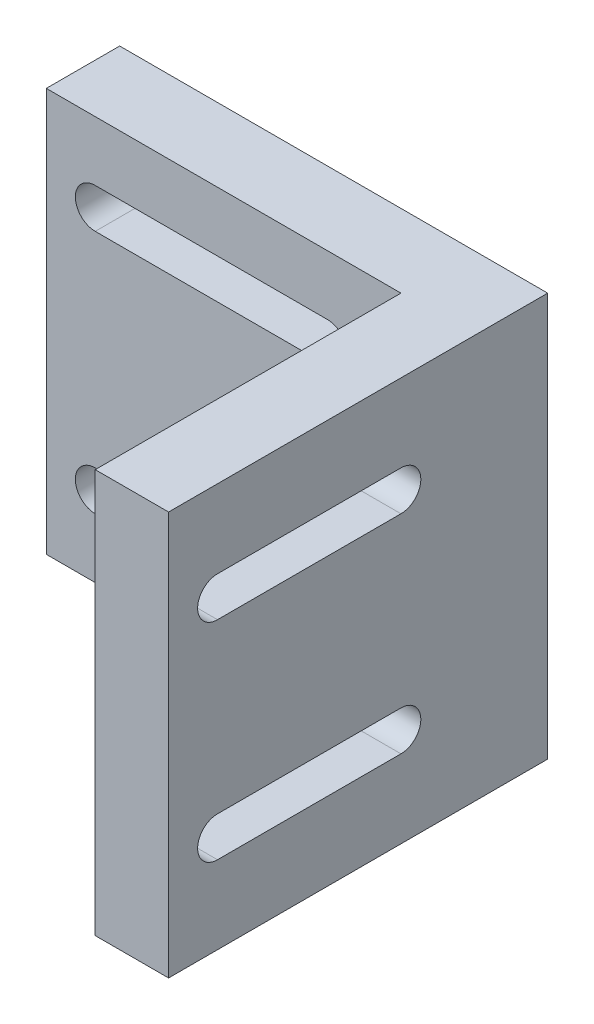
ISO-10303-21;
HEADER;
FILE_DESCRIPTION(('STEP AP214'),'2;1');
FILE_NAME('part.step','',(''),(''),'','','');
FILE_SCHEMA(('AUTOMOTIVE_DESIGN { 1 0 10303 214 1 1 1 1 }'));
ENDSEC;
DATA;
#1=APPLICATION_CONTEXT('core data for automotive mechanical design processes');
#2=APPLICATION_PROTOCOL_DEFINITION('international standard','automotive_design',2000,#1);
#3=PRODUCT_CONTEXT('',#1,'mechanical');
#4=PRODUCT('Part','Part','',(#3));
#5=PRODUCT_RELATED_PRODUCT_CATEGORY('part','',(#4));
#6=PRODUCT_DEFINITION_FORMATION('','',#4);
#7=PRODUCT_DEFINITION_CONTEXT('part definition',#1,'design');
#8=PRODUCT_DEFINITION('design','',#6,#7);
#9=PRODUCT_DEFINITION_SHAPE('','',#8);
#10=(LENGTH_UNIT() NAMED_UNIT(*) SI_UNIT(.MILLI.,.METRE.));
#11=(NAMED_UNIT(*) PLANE_ANGLE_UNIT() SI_UNIT($,.RADIAN.));
#12=(NAMED_UNIT(*) SI_UNIT($,.STERADIAN.) SOLID_ANGLE_UNIT());
#13=UNCERTAINTY_MEASURE_WITH_UNIT(LENGTH_MEASURE(1.E-05),#10,'distance_accuracy_value','');
#14=(GEOMETRIC_REPRESENTATION_CONTEXT(3) GLOBAL_UNCERTAINTY_ASSIGNED_CONTEXT((#13)) GLOBAL_UNIT_ASSIGNED_CONTEXT((#10,
#11,#12)) REPRESENTATION_CONTEXT('',''));
#15=CARTESIAN_POINT('',(0.,0.,0.));
#16=DIRECTION('',(0.,0.,1.));
#17=DIRECTION('',(1.,0.,0.));
#18=AXIS2_PLACEMENT_3D('',#15,#16,#17);
#19=CARTESIAN_POINT('',(0.,66.,12.));
#20=DIRECTION('',(0.,0.,-1.));
#21=DIRECTION('',(-1.,0.,0.));
#22=AXIS2_PLACEMENT_3D('',#19,#20,#21);
#23=PLANE('',#22);
#24=DIRECTION('',(1.,0.,0.));
#25=VECTOR('',#24,1.);
#26=CARTESIAN_POINT('',(8.00000000000001,49.75,12.));
#27=LINE('',#26,#25);
#28=CARTESIAN_POINT('',(8.00000000000001,49.75,12.));
#29=VERTEX_POINT('',#28);
#30=CARTESIAN_POINT('',(46.,49.75,12.));
#31=VERTEX_POINT('',#30);
#32=EDGE_CURVE('E193',#29,#31,#27,.T.);
#33=ORIENTED_EDGE('',*,*,#32,.F.);
#34=CARTESIAN_POINT('',(8.00000000000001,53.,12.));
#35=DIRECTION('',(0.,0.,1.));
#36=DIRECTION('',(-1.,0.,0.));
#37=AXIS2_PLACEMENT_3D('',#34,#35,#36);
#38=CIRCLE('',#37,3.25);
#39=CARTESIAN_POINT('',(8.00000000000001,56.25,12.));
#40=VERTEX_POINT('',#39);
#41=EDGE_CURVE('E48',#40,#29,#38,.T.);
#42=ORIENTED_EDGE('',*,*,#41,.F.);
#43=DIRECTION('',(-1.,0.,0.));
#44=VECTOR('',#43,1.);
#45=CARTESIAN_POINT('',(8.00000000000001,56.25,12.));
#46=LINE('',#45,#44);
#47=CARTESIAN_POINT('',(46.,56.25,12.));
#48=VERTEX_POINT('',#47);
#49=EDGE_CURVE('E199',#48,#40,#46,.T.);
#50=ORIENTED_EDGE('',*,*,#49,.F.);
#51=CARTESIAN_POINT('',(46.,53.,12.));
#52=DIRECTION('',(0.,0.,1.));
#53=DIRECTION('',(-1.,0.,0.));
#54=AXIS2_PLACEMENT_3D('',#51,#52,#53);
#55=CIRCLE('',#54,3.25);
#56=EDGE_CURVE('E184',#31,#48,#55,.T.);
#57=ORIENTED_EDGE('',*,*,#56,.F.);
#58=EDGE_LOOP('',(#33,#42,#50,#57));
#59=FACE_BOUND('',#58,.T.);
#60=DIRECTION('',(1.,0.,0.));
#61=VECTOR('',#60,1.);
#62=CARTESIAN_POINT('',(8.00000000000001,9.75,12.));
#63=LINE('',#62,#61);
#64=CARTESIAN_POINT('',(8.00000000000001,9.75,12.));
#65=VERTEX_POINT('',#64);
#66=CARTESIAN_POINT('',(46.,9.75000000000001,12.));
#67=VERTEX_POINT('',#66);
#68=EDGE_CURVE('E210',#65,#67,#63,.T.);
#69=ORIENTED_EDGE('',*,*,#68,.F.);
#70=CARTESIAN_POINT('',(8.00000000000001,13.,12.));
#71=DIRECTION('',(0.,0.,1.));
#72=DIRECTION('',(1.,0.,0.));
#73=AXIS2_PLACEMENT_3D('',#70,#71,#72);
#74=CIRCLE('',#73,3.25);
#75=CARTESIAN_POINT('',(8.00000000000001,16.25,12.));
#76=VERTEX_POINT('',#75);
#77=EDGE_CURVE('E206',#76,#65,#74,.T.);
#78=ORIENTED_EDGE('',*,*,#77,.F.);
#79=DIRECTION('',(-1.,0.,0.));
#80=VECTOR('',#79,1.);
#81=CARTESIAN_POINT('',(8.00000000000001,16.25,12.));
#82=LINE('',#81,#80);
#83=CARTESIAN_POINT('',(46.,16.25,12.));
#84=VERTEX_POINT('',#83);
#85=EDGE_CURVE('E216',#84,#76,#82,.T.);
#86=ORIENTED_EDGE('',*,*,#85,.F.);
#87=CARTESIAN_POINT('',(46.,13.,12.));
#88=DIRECTION('',(0.,0.,1.));
#89=DIRECTION('',(1.,0.,0.));
#90=AXIS2_PLACEMENT_3D('',#87,#88,#89);
#91=CIRCLE('',#90,3.25);
#92=EDGE_CURVE('E213',#67,#84,#91,.T.);
#93=ORIENTED_EDGE('',*,*,#92,.F.);
#94=EDGE_LOOP('',(#69,#78,#86,#93));
#95=FACE_BOUND('',#94,.T.);
#96=DIRECTION('',(0.,-1.,0.));
#97=VECTOR('',#96,1.);
#98=CARTESIAN_POINT('',(58.,0.,12.));
#99=LINE('',#98,#97);
#100=CARTESIAN_POINT('',(58.,66.,12.));
#101=VERTEX_POINT('',#100);
#102=CARTESIAN_POINT('',(58.,0.,12.));
#103=VERTEX_POINT('',#102);
#104=EDGE_CURVE('E292',#101,#103,#99,.T.);
#105=ORIENTED_EDGE('',*,*,#104,.F.);
#106=DIRECTION('',(-1.,0.,0.));
#107=VECTOR('',#106,1.);
#108=CARTESIAN_POINT('',(0.,66.,12.));
#109=LINE('',#108,#107);
#110=CARTESIAN_POINT('',(0.,66.,12.));
#111=VERTEX_POINT('',#110);
#112=EDGE_CURVE('E312',#101,#111,#109,.T.);
#113=ORIENTED_EDGE('',*,*,#112,.T.);
#114=DIRECTION('',(0.,-1.,0.));
#115=VECTOR('',#114,1.);
#116=CARTESIAN_POINT('',(0.,0.,12.));
#117=LINE('',#116,#115);
#118=CARTESIAN_POINT('',(0.,0.,12.));
#119=VERTEX_POINT('',#118);
#120=EDGE_CURVE('E306',#111,#119,#117,.T.);
#121=ORIENTED_EDGE('',*,*,#120,.T.);
#122=DIRECTION('',(1.,0.,0.));
#123=VECTOR('',#122,1.);
#124=CARTESIAN_POINT('',(0.,0.,12.));
#125=LINE('',#124,#123);
#126=EDGE_CURVE('E410',#119,#103,#125,.T.);
#127=ORIENTED_EDGE('',*,*,#126,.T.);
#128=EDGE_LOOP('',(#105,#113,#121,#127));
#129=FACE_BOUND('',#128,.T.);
#130=ADVANCED_FACE('F33',(#59,#95,#129),#23,.F.);
#131=CARTESIAN_POINT('',(0.,0.,12.));
#132=DIRECTION('',(1.,0.,0.));
#133=DIRECTION('',(0.,0.,-1.));
#134=AXIS2_PLACEMENT_3D('',#131,#132,#133);
#135=PLANE('',#134);
#136=DIRECTION('',(0.,-1.,0.));
#137=VECTOR('',#136,1.);
#138=CARTESIAN_POINT('',(0.,0.,0.));
#139=LINE('',#138,#137);
#140=CARTESIAN_POINT('',(0.,66.,0.));
#141=VERTEX_POINT('',#140);
#142=CARTESIAN_POINT('',(0.,0.,0.));
#143=VERTEX_POINT('',#142);
#144=EDGE_CURVE('E322',#141,#143,#139,.T.);
#145=ORIENTED_EDGE('',*,*,#144,.T.);
#146=DIRECTION('',(0.,0.,-1.));
#147=VECTOR('',#146,1.);
#148=CARTESIAN_POINT('',(0.,0.,12.));
#149=LINE('',#148,#147);
#150=EDGE_CURVE('E328',#119,#143,#149,.T.);
#151=ORIENTED_EDGE('',*,*,#150,.F.);
#152=ORIENTED_EDGE('',*,*,#120,.F.);
#153=DIRECTION('',(0.,0.,-1.));
#154=VECTOR('',#153,1.);
#155=CARTESIAN_POINT('',(0.,66.,12.));
#156=LINE('',#155,#154);
#157=EDGE_CURVE('E406',#111,#141,#156,.T.);
#158=ORIENTED_EDGE('',*,*,#157,.T.);
#159=EDGE_LOOP('',(#145,#151,#152,#158));
#160=FACE_BOUND('',#159,.T.);
#161=ADVANCED_FACE('F35',(#160),#135,.F.);
#162=CARTESIAN_POINT('',(0.,0.,12.));
#163=DIRECTION('',(0.,1.,0.));
#164=DIRECTION('',(0.,0.,1.));
#165=AXIS2_PLACEMENT_3D('',#162,#163,#164);
#166=PLANE('',#165);
#167=DIRECTION('',(1.,0.,0.));
#168=VECTOR('',#167,1.);
#169=CARTESIAN_POINT('',(0.,0.,0.));
#170=LINE('',#169,#168);
#171=CARTESIAN_POINT('',(70.,0.,0.));
#172=VERTEX_POINT('',#171);
#173=EDGE_CURVE('E384',#143,#172,#170,.T.);
#174=ORIENTED_EDGE('',*,*,#173,.T.);
#175=DIRECTION('',(0.,0.,-1.));
#176=VECTOR('',#175,1.);
#177=CARTESIAN_POINT('',(70.,0.,12.));
#178=LINE('',#177,#176);
#179=CARTESIAN_POINT('',(70.,0.,62.));
#180=VERTEX_POINT('',#179);
#181=EDGE_CURVE('E387',#180,#172,#178,.T.);
#182=ORIENTED_EDGE('',*,*,#181,.F.);
#183=DIRECTION('',(1.,0.,0.));
#184=VECTOR('',#183,1.);
#185=CARTESIAN_POINT('',(70.,0.,62.));
#186=LINE('',#185,#184);
#187=CARTESIAN_POINT('',(58.,0.,62.));
#188=VERTEX_POINT('',#187);
#189=EDGE_CURVE('E300',#188,#180,#186,.T.);
#190=ORIENTED_EDGE('',*,*,#189,.F.);
#191=DIRECTION('',(0.,0.,-1.));
#192=VECTOR('',#191,1.);
#193=CARTESIAN_POINT('',(58.,0.,62.));
#194=LINE('',#193,#192);
#195=EDGE_CURVE('E303',#188,#103,#194,.T.);
#196=ORIENTED_EDGE('',*,*,#195,.T.);
#197=ORIENTED_EDGE('',*,*,#126,.F.);
#198=ORIENTED_EDGE('',*,*,#150,.T.);
#199=EDGE_LOOP('',(#174,#182,#190,#196,#197,#198));
#200=FACE_BOUND('',#199,.T.);
#201=ADVANCED_FACE('F364',(#200),#166,.F.);
#202=CARTESIAN_POINT('',(70.,0.,12.));
#203=DIRECTION('',(-1.,0.,0.));
#204=DIRECTION('',(0.,0.,1.));
#205=AXIS2_PLACEMENT_3D('',#202,#203,#204);
#206=PLANE('',#205);
#207=DIRECTION('',(0.,0.,-1.));
#208=VECTOR('',#207,1.);
#209=CARTESIAN_POINT('',(70.,53.25,12.));
#210=LINE('',#209,#208);
#211=CARTESIAN_POINT('',(70.,53.25,54.));
#212=VERTEX_POINT('',#211);
#213=CARTESIAN_POINT('',(70.,53.25,24.));
#214=VERTEX_POINT('',#213);
#215=EDGE_CURVE('E254',#212,#214,#210,.T.);
#216=ORIENTED_EDGE('',*,*,#215,.T.);
#217=CARTESIAN_POINT('',(70.,50.,24.));
#218=DIRECTION('',(-1.,0.,0.));
#219=DIRECTION('',(0.,0.,1.));
#220=AXIS2_PLACEMENT_3D('',#217,#218,#219);
#221=CIRCLE('',#220,3.25);
#222=CARTESIAN_POINT('',(70.,46.75,24.));
#223=VERTEX_POINT('',#222);
#224=EDGE_CURVE('E257',#214,#223,#221,.T.);
#225=ORIENTED_EDGE('',*,*,#224,.T.);
#226=DIRECTION('',(0.,0.,1.));
#227=VECTOR('',#226,1.);
#228=CARTESIAN_POINT('',(70.,46.75,12.));
#229=LINE('',#228,#227);
#230=CARTESIAN_POINT('',(70.,46.75,54.));
#231=VERTEX_POINT('',#230);
#232=EDGE_CURVE('E242',#223,#231,#229,.T.);
#233=ORIENTED_EDGE('',*,*,#232,.T.);
#234=CARTESIAN_POINT('',(70.,50.,54.));
#235=DIRECTION('',(-1.,0.,0.));
#236=DIRECTION('',(0.,0.,1.));
#237=AXIS2_PLACEMENT_3D('',#234,#235,#236);
#238=CIRCLE('',#237,3.25);
#239=EDGE_CURVE('E251',#231,#212,#238,.T.);
#240=ORIENTED_EDGE('',*,*,#239,.T.);
#241=EDGE_LOOP('',(#216,#225,#233,#240));
#242=FACE_BOUND('',#241,.T.);
#243=DIRECTION('',(0.,0.,-1.));
#244=VECTOR('',#243,1.);
#245=CARTESIAN_POINT('',(70.,19.25,12.));
#246=LINE('',#245,#244);
#247=CARTESIAN_POINT('',(70.,19.25,54.));
#248=VERTEX_POINT('',#247);
#249=CARTESIAN_POINT('',(70.,19.25,24.));
#250=VERTEX_POINT('',#249);
#251=EDGE_CURVE('E286',#248,#250,#246,.T.);
#252=ORIENTED_EDGE('',*,*,#251,.T.);
#253=CARTESIAN_POINT('',(70.,16.,24.));
#254=DIRECTION('',(-1.,0.,0.));
#255=DIRECTION('',(0.,0.,1.));
#256=AXIS2_PLACEMENT_3D('',#253,#254,#255);
#257=CIRCLE('',#256,3.25);
#258=CARTESIAN_POINT('',(70.,12.75,24.));
#259=VERTEX_POINT('',#258);
#260=EDGE_CURVE('E289',#250,#259,#257,.T.);
#261=ORIENTED_EDGE('',*,*,#260,.T.);
#262=DIRECTION('',(0.,0.,1.));
#263=VECTOR('',#262,1.);
#264=CARTESIAN_POINT('',(70.,12.75,12.));
#265=LINE('',#264,#263);
#266=CARTESIAN_POINT('',(70.,12.75,54.));
#267=VERTEX_POINT('',#266);
#268=EDGE_CURVE('E274',#259,#267,#265,.T.);
#269=ORIENTED_EDGE('',*,*,#268,.T.);
#270=CARTESIAN_POINT('',(70.,16.,54.));
#271=DIRECTION('',(-1.,0.,0.));
#272=DIRECTION('',(0.,0.,1.));
#273=AXIS2_PLACEMENT_3D('',#270,#271,#272);
#274=CIRCLE('',#273,3.25);
#275=EDGE_CURVE('E283',#267,#248,#274,.T.);
#276=ORIENTED_EDGE('',*,*,#275,.T.);
#277=EDGE_LOOP('',(#252,#261,#269,#276));
#278=FACE_BOUND('',#277,.T.);
#279=DIRECTION('',(0.,1.,0.));
#280=VECTOR('',#279,1.);
#281=CARTESIAN_POINT('',(70.,0.,0.));
#282=LINE('',#281,#280);
#283=CARTESIAN_POINT('',(70.,66.,0.));
#284=VERTEX_POINT('',#283);
#285=EDGE_CURVE('E393',#172,#284,#282,.T.);
#286=ORIENTED_EDGE('',*,*,#285,.T.);
#287=DIRECTION('',(0.,0.,-1.));
#288=VECTOR('',#287,1.);
#289=CARTESIAN_POINT('',(70.,66.,12.));
#290=LINE('',#289,#288);
#291=CARTESIAN_POINT('',(70.,66.,62.));
#292=VERTEX_POINT('',#291);
#293=EDGE_CURVE('E398',#292,#284,#290,.T.);
#294=ORIENTED_EDGE('',*,*,#293,.F.);
#295=DIRECTION('',(0.,1.,0.));
#296=VECTOR('',#295,1.);
#297=CARTESIAN_POINT('',(70.,0.,62.));
#298=LINE('',#297,#296);
#299=EDGE_CURVE('E293',#180,#292,#298,.T.);
#300=ORIENTED_EDGE('',*,*,#299,.F.);
#301=ORIENTED_EDGE('',*,*,#181,.T.);
#302=EDGE_LOOP('',(#286,#294,#300,#301));
#303=FACE_BOUND('',#302,.T.);
#304=ADVANCED_FACE('F375',(#242,#278,#303),#206,.F.);
#305=CARTESIAN_POINT('',(0.,66.,12.));
#306=DIRECTION('',(0.,-1.,0.));
#307=DIRECTION('',(0.,0.,-1.));
#308=AXIS2_PLACEMENT_3D('',#305,#306,#307);
#309=PLANE('',#308);
#310=DIRECTION('',(-1.,0.,0.));
#311=VECTOR('',#310,1.);
#312=CARTESIAN_POINT('',(0.,66.,0.));
#313=LINE('',#312,#311);
#314=EDGE_CURVE('E401',#284,#141,#313,.T.);
#315=ORIENTED_EDGE('',*,*,#314,.T.);
#316=ORIENTED_EDGE('',*,*,#157,.F.);
#317=ORIENTED_EDGE('',*,*,#112,.F.);
#318=DIRECTION('',(0.,0.,-1.));
#319=VECTOR('',#318,1.);
#320=CARTESIAN_POINT('',(58.,66.,62.));
#321=LINE('',#320,#319);
#322=CARTESIAN_POINT('',(58.,66.,62.));
#323=VERTEX_POINT('',#322);
#324=EDGE_CURVE('E317',#323,#101,#321,.T.);
#325=ORIENTED_EDGE('',*,*,#324,.F.);
#326=DIRECTION('',(-1.,0.,0.));
#327=VECTOR('',#326,1.);
#328=CARTESIAN_POINT('',(70.,66.,62.));
#329=LINE('',#328,#327);
#330=EDGE_CURVE('E296',#292,#323,#329,.T.);
#331=ORIENTED_EDGE('',*,*,#330,.F.);
#332=ORIENTED_EDGE('',*,*,#293,.T.);
#333=EDGE_LOOP('',(#315,#316,#317,#325,#331,#332));
#334=FACE_BOUND('',#333,.T.);
#335=ADVANCED_FACE('F372',(#334),#309,.F.);
#336=CARTESIAN_POINT('',(0.,66.,0.));
#337=DIRECTION('',(0.,0.,-1.));
#338=DIRECTION('',(-1.,0.,0.));
#339=AXIS2_PLACEMENT_3D('',#336,#337,#338);
#340=PLANE('',#339);
#341=CARTESIAN_POINT('',(8.00000000000001,53.,0.));
#342=DIRECTION('',(0.,0.,-1.));
#343=DIRECTION('',(-1.,0.,0.));
#344=AXIS2_PLACEMENT_3D('',#341,#342,#343);
#345=CIRCLE('',#344,3.25);
#346=CARTESIAN_POINT('',(8.00000000000001,49.75,0.));
#347=VERTEX_POINT('',#346);
#348=CARTESIAN_POINT('',(8.00000000000001,56.25,0.));
#349=VERTEX_POINT('',#348);
#350=EDGE_CURVE('E11',#347,#349,#345,.T.);
#351=ORIENTED_EDGE('',*,*,#350,.F.);
#352=DIRECTION('',(-1.,0.,0.));
#353=VECTOR('',#352,1.);
#354=CARTESIAN_POINT('',(0.,49.75,0.));
#355=LINE('',#354,#353);
#356=CARTESIAN_POINT('',(46.,49.75,0.));
#357=VERTEX_POINT('',#356);
#358=EDGE_CURVE('E335',#357,#347,#355,.T.);
#359=ORIENTED_EDGE('',*,*,#358,.F.);
#360=CARTESIAN_POINT('',(46.,53.,0.));
#361=DIRECTION('',(0.,0.,-1.));
#362=DIRECTION('',(-1.,0.,0.));
#363=AXIS2_PLACEMENT_3D('',#360,#361,#362);
#364=CIRCLE('',#363,3.25);
#365=CARTESIAN_POINT('',(46.,56.25,0.));
#366=VERTEX_POINT('',#365);
#367=EDGE_CURVE('E187',#366,#357,#364,.T.);
#368=ORIENTED_EDGE('',*,*,#367,.F.);
#369=DIRECTION('',(1.,0.,0.));
#370=VECTOR('',#369,1.);
#371=CARTESIAN_POINT('',(0.,56.25,0.));
#372=LINE('',#371,#370);
#373=EDGE_CURVE('E41',#349,#366,#372,.T.);
#374=ORIENTED_EDGE('',*,*,#373,.F.);
#375=EDGE_LOOP('',(#351,#359,#368,#374));
#376=FACE_BOUND('',#375,.T.);
#377=CARTESIAN_POINT('',(8.00000000000001,13.,0.));
#378=DIRECTION('',(0.,0.,-1.));
#379=DIRECTION('',(-1.,0.,0.));
#380=AXIS2_PLACEMENT_3D('',#377,#378,#379);
#381=CIRCLE('',#380,3.25);
#382=CARTESIAN_POINT('',(8.00000000000001,9.75,0.));
#383=VERTEX_POINT('',#382);
#384=CARTESIAN_POINT('',(8.00000000000001,16.25,0.));
#385=VERTEX_POINT('',#384);
#386=EDGE_CURVE('E333',#383,#385,#381,.T.);
#387=ORIENTED_EDGE('',*,*,#386,.F.);
#388=DIRECTION('',(-1.,0.,0.));
#389=VECTOR('',#388,1.);
#390=CARTESIAN_POINT('',(0.,9.75,0.));
#391=LINE('',#390,#389);
#392=CARTESIAN_POINT('',(46.,9.75,0.));
#393=VERTEX_POINT('',#392);
#394=EDGE_CURVE('E325',#393,#383,#391,.T.);
#395=ORIENTED_EDGE('',*,*,#394,.F.);
#396=CARTESIAN_POINT('',(46.,13.,0.));
#397=DIRECTION('',(0.,0.,-1.));
#398=DIRECTION('',(-1.,0.,0.));
#399=AXIS2_PLACEMENT_3D('',#396,#397,#398);
#400=CIRCLE('',#399,3.25);
#401=CARTESIAN_POINT('',(46.,16.25,0.));
#402=VERTEX_POINT('',#401);
#403=EDGE_CURVE('E327',#402,#393,#400,.T.);
#404=ORIENTED_EDGE('',*,*,#403,.F.);
#405=DIRECTION('',(1.,0.,0.));
#406=VECTOR('',#405,1.);
#407=CARTESIAN_POINT('',(0.,16.25,0.));
#408=LINE('',#407,#406);
#409=EDGE_CURVE('E331',#385,#402,#408,.T.);
#410=ORIENTED_EDGE('',*,*,#409,.F.);
#411=EDGE_LOOP('',(#387,#395,#404,#410));
#412=FACE_BOUND('',#411,.T.);
#413=ORIENTED_EDGE('',*,*,#144,.F.);
#414=ORIENTED_EDGE('',*,*,#314,.F.);
#415=ORIENTED_EDGE('',*,*,#285,.F.);
#416=ORIENTED_EDGE('',*,*,#173,.F.);
#417=EDGE_LOOP('',(#413,#414,#415,#416));
#418=FACE_BOUND('',#417,.T.);
#419=ADVANCED_FACE('F343',(#376,#412,#418),#340,.T.);
#420=CARTESIAN_POINT('',(58.,0.,62.));
#421=DIRECTION('',(1.,0.,0.));
#422=DIRECTION('',(0.,0.,-1.));
#423=AXIS2_PLACEMENT_3D('',#420,#421,#422);
#424=PLANE('',#423);
#425=DIRECTION('',(0.,0.,1.));
#426=VECTOR('',#425,1.);
#427=CARTESIAN_POINT('',(58.,46.75,24.));
#428=LINE('',#427,#426);
#429=CARTESIAN_POINT('',(58.,46.75,24.));
#430=VERTEX_POINT('',#429);
#431=CARTESIAN_POINT('',(58.,46.75,54.));
#432=VERTEX_POINT('',#431);
#433=EDGE_CURVE('E230',#430,#432,#428,.T.);
#434=ORIENTED_EDGE('',*,*,#433,.F.);
#435=CARTESIAN_POINT('',(58.,50.,24.));
#436=DIRECTION('',(-1.,0.,0.));
#437=DIRECTION('',(0.,0.,-1.));
#438=AXIS2_PLACEMENT_3D('',#435,#436,#437);
#439=CIRCLE('',#438,3.25);
#440=CARTESIAN_POINT('',(58.,53.25,24.));
#441=VERTEX_POINT('',#440);
#442=EDGE_CURVE('E222',#441,#430,#439,.T.);
#443=ORIENTED_EDGE('',*,*,#442,.F.);
#444=DIRECTION('',(0.,0.,-1.));
#445=VECTOR('',#444,1.);
#446=CARTESIAN_POINT('',(58.,53.25,24.));
#447=LINE('',#446,#445);
#448=CARTESIAN_POINT('',(58.,53.25,54.));
#449=VERTEX_POINT('',#448);
#450=EDGE_CURVE('E236',#449,#441,#447,.T.);
#451=ORIENTED_EDGE('',*,*,#450,.F.);
#452=CARTESIAN_POINT('',(58.,50.,54.));
#453=DIRECTION('',(-1.,0.,0.));
#454=DIRECTION('',(0.,0.,-1.));
#455=AXIS2_PLACEMENT_3D('',#452,#453,#454);
#456=CIRCLE('',#455,3.25);
#457=EDGE_CURVE('E233',#432,#449,#456,.T.);
#458=ORIENTED_EDGE('',*,*,#457,.F.);
#459=EDGE_LOOP('',(#434,#443,#451,#458));
#460=FACE_BOUND('',#459,.T.);
#461=DIRECTION('',(0.,0.,1.));
#462=VECTOR('',#461,1.);
#463=CARTESIAN_POINT('',(58.,12.75,24.));
#464=LINE('',#463,#462);
#465=CARTESIAN_POINT('',(58.,12.75,24.));
#466=VERTEX_POINT('',#465);
#467=CARTESIAN_POINT('',(58.,12.75,54.));
#468=VERTEX_POINT('',#467);
#469=EDGE_CURVE('E262',#466,#468,#464,.T.);
#470=ORIENTED_EDGE('',*,*,#469,.F.);
#471=CARTESIAN_POINT('',(58.,16.,24.));
#472=DIRECTION('',(-1.,0.,0.));
#473=DIRECTION('',(0.,0.,1.));
#474=AXIS2_PLACEMENT_3D('',#471,#472,#473);
#475=CIRCLE('',#474,3.25);
#476=CARTESIAN_POINT('',(58.,19.25,24.));
#477=VERTEX_POINT('',#476);
#478=EDGE_CURVE('E260',#477,#466,#475,.T.);
#479=ORIENTED_EDGE('',*,*,#478,.F.);
#480=DIRECTION('',(0.,0.,-1.));
#481=VECTOR('',#480,1.);
#482=CARTESIAN_POINT('',(58.,19.25,24.));
#483=LINE('',#482,#481);
#484=CARTESIAN_POINT('',(58.,19.25,54.));
#485=VERTEX_POINT('',#484);
#486=EDGE_CURVE('E268',#485,#477,#483,.T.);
#487=ORIENTED_EDGE('',*,*,#486,.F.);
#488=CARTESIAN_POINT('',(58.,16.,54.));
#489=DIRECTION('',(-1.,0.,0.));
#490=DIRECTION('',(0.,0.,1.));
#491=AXIS2_PLACEMENT_3D('',#488,#489,#490);
#492=CIRCLE('',#491,3.25);
#493=EDGE_CURVE('E265',#468,#485,#492,.T.);
#494=ORIENTED_EDGE('',*,*,#493,.F.);
#495=EDGE_LOOP('',(#470,#479,#487,#494));
#496=FACE_BOUND('',#495,.T.);
#497=ORIENTED_EDGE('',*,*,#104,.T.);
#498=ORIENTED_EDGE('',*,*,#195,.F.);
#499=DIRECTION('',(0.,-1.,0.));
#500=VECTOR('',#499,1.);
#501=CARTESIAN_POINT('',(58.,0.,62.));
#502=LINE('',#501,#500);
#503=EDGE_CURVE('E298',#323,#188,#502,.T.);
#504=ORIENTED_EDGE('',*,*,#503,.F.);
#505=ORIENTED_EDGE('',*,*,#324,.T.);
#506=EDGE_LOOP('',(#497,#498,#504,#505));
#507=FACE_BOUND('',#506,.T.);
#508=ADVANCED_FACE('F368',(#460,#496,#507),#424,.F.);
#509=CARTESIAN_POINT('',(70.,66.,62.));
#510=DIRECTION('',(0.,0.,1.));
#511=DIRECTION('',(1.,0.,0.));
#512=AXIS2_PLACEMENT_3D('',#509,#510,#511);
#513=PLANE('',#512);
#514=ORIENTED_EDGE('',*,*,#299,.T.);
#515=ORIENTED_EDGE('',*,*,#330,.T.);
#516=ORIENTED_EDGE('',*,*,#503,.T.);
#517=ORIENTED_EDGE('',*,*,#189,.T.);
#518=EDGE_LOOP('',(#514,#515,#516,#517));
#519=FACE_BOUND('',#518,.T.);
#520=ADVANCED_FACE('F421',(#519),#513,.T.);
#521=CARTESIAN_POINT('',(98.,16.,24.));
#522=DIRECTION('',(-1.,0.,0.));
#523=DIRECTION('',(0.,0.,1.));
#524=AXIS2_PLACEMENT_3D('',#521,#522,#523);
#525=CYLINDRICAL_SURFACE('',#524,3.25);
#526=DIRECTION('',(-1.,0.,0.));
#527=VECTOR('',#526,1.);
#528=CARTESIAN_POINT('',(98.,19.25,24.));
#529=LINE('',#528,#527);
#530=EDGE_CURVE('E272',#250,#477,#529,.T.);
#531=ORIENTED_EDGE('',*,*,#530,.T.);
#532=ORIENTED_EDGE('',*,*,#478,.T.);
#533=DIRECTION('',(-1.,0.,0.));
#534=VECTOR('',#533,1.);
#535=CARTESIAN_POINT('',(98.,12.75,24.));
#536=LINE('',#535,#534);
#537=EDGE_CURVE('E271',#259,#466,#536,.T.);
#538=ORIENTED_EDGE('',*,*,#537,.F.);
#539=ORIENTED_EDGE('',*,*,#260,.F.);
#540=EDGE_LOOP('',(#531,#532,#538,#539));
#541=FACE_BOUND('',#540,.T.);
#542=ADVANCED_FACE('F430',(#541),#525,.F.);
#543=CARTESIAN_POINT('',(98.,19.25,24.));
#544=DIRECTION('',(0.,1.,0.));
#545=DIRECTION('',(0.,0.,1.));
#546=AXIS2_PLACEMENT_3D('',#543,#544,#545);
#547=PLANE('',#546);
#548=DIRECTION('',(-1.,0.,0.));
#549=VECTOR('',#548,1.);
#550=CARTESIAN_POINT('',(98.,19.25,54.));
#551=LINE('',#550,#549);
#552=EDGE_CURVE('E275',#248,#485,#551,.T.);
#553=ORIENTED_EDGE('',*,*,#552,.T.);
#554=ORIENTED_EDGE('',*,*,#486,.T.);
#555=ORIENTED_EDGE('',*,*,#530,.F.);
#556=ORIENTED_EDGE('',*,*,#251,.F.);
#557=EDGE_LOOP('',(#553,#554,#555,#556));
#558=FACE_BOUND('',#557,.T.);
#559=ADVANCED_FACE('F448',(#558),#547,.F.);
#560=CARTESIAN_POINT('',(98.,16.,54.));
#561=DIRECTION('',(-1.,0.,0.));
#562=DIRECTION('',(0.,0.,1.));
#563=AXIS2_PLACEMENT_3D('',#560,#561,#562);
#564=CYLINDRICAL_SURFACE('',#563,3.25);
#565=DIRECTION('',(-1.,0.,0.));
#566=VECTOR('',#565,1.);
#567=CARTESIAN_POINT('',(98.,12.75,54.));
#568=LINE('',#567,#566);
#569=EDGE_CURVE('E277',#267,#468,#568,.T.);
#570=ORIENTED_EDGE('',*,*,#569,.T.);
#571=ORIENTED_EDGE('',*,*,#493,.T.);
#572=ORIENTED_EDGE('',*,*,#552,.F.);
#573=ORIENTED_EDGE('',*,*,#275,.F.);
#574=EDGE_LOOP('',(#570,#571,#572,#573));
#575=FACE_BOUND('',#574,.T.);
#576=ADVANCED_FACE('F450',(#575),#564,.F.);
#577=CARTESIAN_POINT('',(98.,12.75,24.));
#578=DIRECTION('',(0.,-1.,0.));
#579=DIRECTION('',(0.,0.,-1.));
#580=AXIS2_PLACEMENT_3D('',#577,#578,#579);
#581=PLANE('',#580);
#582=ORIENTED_EDGE('',*,*,#537,.T.);
#583=ORIENTED_EDGE('',*,*,#469,.T.);
#584=ORIENTED_EDGE('',*,*,#569,.F.);
#585=ORIENTED_EDGE('',*,*,#268,.F.);
#586=EDGE_LOOP('',(#582,#583,#584,#585));
#587=FACE_BOUND('',#586,.T.);
#588=ADVANCED_FACE('F440',(#587),#581,.F.);
#589=CARTESIAN_POINT('',(98.,50.,24.));
#590=DIRECTION('',(-1.,0.,0.));
#591=DIRECTION('',(0.,0.,1.));
#592=AXIS2_PLACEMENT_3D('',#589,#590,#591);
#593=CYLINDRICAL_SURFACE('',#592,3.25);
#594=DIRECTION('',(-1.,0.,0.));
#595=VECTOR('',#594,1.);
#596=CARTESIAN_POINT('',(98.,53.25,24.));
#597=LINE('',#596,#595);
#598=EDGE_CURVE('E240',#214,#441,#597,.T.);
#599=ORIENTED_EDGE('',*,*,#598,.T.);
#600=ORIENTED_EDGE('',*,*,#442,.T.);
#601=DIRECTION('',(-1.,0.,0.));
#602=VECTOR('',#601,1.);
#603=CARTESIAN_POINT('',(98.,46.75,24.));
#604=LINE('',#603,#602);
#605=EDGE_CURVE('E239',#223,#430,#604,.T.);
#606=ORIENTED_EDGE('',*,*,#605,.F.);
#607=ORIENTED_EDGE('',*,*,#224,.F.);
#608=EDGE_LOOP('',(#599,#600,#606,#607));
#609=FACE_BOUND('',#608,.T.);
#610=ADVANCED_FACE('F457',(#609),#593,.F.);
#611=CARTESIAN_POINT('',(98.,53.25,24.));
#612=DIRECTION('',(0.,1.,0.));
#613=DIRECTION('',(0.,0.,1.));
#614=AXIS2_PLACEMENT_3D('',#611,#612,#613);
#615=PLANE('',#614);
#616=DIRECTION('',(-1.,0.,0.));
#617=VECTOR('',#616,1.);
#618=CARTESIAN_POINT('',(98.,53.25,54.));
#619=LINE('',#618,#617);
#620=EDGE_CURVE('E243',#212,#449,#619,.T.);
#621=ORIENTED_EDGE('',*,*,#620,.T.);
#622=ORIENTED_EDGE('',*,*,#450,.T.);
#623=ORIENTED_EDGE('',*,*,#598,.F.);
#624=ORIENTED_EDGE('',*,*,#215,.F.);
#625=EDGE_LOOP('',(#621,#622,#623,#624));
#626=FACE_BOUND('',#625,.T.);
#627=ADVANCED_FACE('F490',(#626),#615,.F.);
#628=CARTESIAN_POINT('',(98.,50.,54.));
#629=DIRECTION('',(-1.,0.,0.));
#630=DIRECTION('',(0.,0.,1.));
#631=AXIS2_PLACEMENT_3D('',#628,#629,#630);
#632=CYLINDRICAL_SURFACE('',#631,3.25);
#633=DIRECTION('',(-1.,0.,0.));
#634=VECTOR('',#633,1.);
#635=CARTESIAN_POINT('',(98.,46.75,54.));
#636=LINE('',#635,#634);
#637=EDGE_CURVE('E245',#231,#432,#636,.T.);
#638=ORIENTED_EDGE('',*,*,#637,.T.);
#639=ORIENTED_EDGE('',*,*,#457,.T.);
#640=ORIENTED_EDGE('',*,*,#620,.F.);
#641=ORIENTED_EDGE('',*,*,#239,.F.);
#642=EDGE_LOOP('',(#638,#639,#640,#641));
#643=FACE_BOUND('',#642,.T.);
#644=ADVANCED_FACE('F499',(#643),#632,.F.);
#645=CARTESIAN_POINT('',(98.,46.75,24.));
#646=DIRECTION('',(0.,-1.,0.));
#647=DIRECTION('',(0.,0.,-1.));
#648=AXIS2_PLACEMENT_3D('',#645,#646,#647);
#649=PLANE('',#648);
#650=ORIENTED_EDGE('',*,*,#605,.T.);
#651=ORIENTED_EDGE('',*,*,#433,.T.);
#652=ORIENTED_EDGE('',*,*,#637,.F.);
#653=ORIENTED_EDGE('',*,*,#232,.F.);
#654=EDGE_LOOP('',(#650,#651,#652,#653));
#655=FACE_BOUND('',#654,.T.);
#656=ADVANCED_FACE('F509',(#655),#649,.F.);
#657=CARTESIAN_POINT('',(8.00000000000001,13.,-28.));
#658=DIRECTION('',(0.,0.,1.));
#659=DIRECTION('',(1.,0.,0.));
#660=AXIS2_PLACEMENT_3D('',#657,#658,#659);
#661=CYLINDRICAL_SURFACE('',#660,3.25);
#662=ORIENTED_EDGE('',*,*,#386,.T.);
#663=DIRECTION('',(0.,0.,1.));
#664=VECTOR('',#663,1.);
#665=CARTESIAN_POINT('',(8.00000000000001,16.25,-28.));
#666=LINE('',#665,#664);
#667=EDGE_CURVE('E220',#385,#76,#666,.T.);
#668=ORIENTED_EDGE('',*,*,#667,.T.);
#669=ORIENTED_EDGE('',*,*,#77,.T.);
#670=DIRECTION('',(0.,0.,1.));
#671=VECTOR('',#670,1.);
#672=CARTESIAN_POINT('',(8.00000000000001,9.75,-28.));
#673=LINE('',#672,#671);
#674=EDGE_CURVE('E219',#383,#65,#673,.T.);
#675=ORIENTED_EDGE('',*,*,#674,.F.);
#676=EDGE_LOOP('',(#662,#668,#669,#675));
#677=FACE_BOUND('',#676,.T.);
#678=ADVANCED_FACE('F518',(#677),#661,.F.);
#679=CARTESIAN_POINT('',(8.00000000000001,16.25,-28.));
#680=DIRECTION('',(0.,1.,0.));
#681=DIRECTION('',(0.,0.,1.));
#682=AXIS2_PLACEMENT_3D('',#679,#680,#681);
#683=PLANE('',#682);
#684=ORIENTED_EDGE('',*,*,#409,.T.);
#685=DIRECTION('',(0.,0.,1.));
#686=VECTOR('',#685,1.);
#687=CARTESIAN_POINT('',(46.,16.25,-28.));
#688=LINE('',#687,#686);
#689=EDGE_CURVE('E223',#402,#84,#688,.T.);
#690=ORIENTED_EDGE('',*,*,#689,.T.);
#691=ORIENTED_EDGE('',*,*,#85,.T.);
#692=ORIENTED_EDGE('',*,*,#667,.F.);
#693=EDGE_LOOP('',(#684,#690,#691,#692));
#694=FACE_BOUND('',#693,.T.);
#695=ADVANCED_FACE('F541',(#694),#683,.F.);
#696=CARTESIAN_POINT('',(46.,13.,-28.));
#697=DIRECTION('',(0.,0.,1.));
#698=DIRECTION('',(1.,0.,0.));
#699=AXIS2_PLACEMENT_3D('',#696,#697,#698);
#700=CYLINDRICAL_SURFACE('',#699,3.25);
#701=ORIENTED_EDGE('',*,*,#403,.T.);
#702=DIRECTION('',(0.,0.,1.));
#703=VECTOR('',#702,1.);
#704=CARTESIAN_POINT('',(46.,9.75000000000001,-28.));
#705=LINE('',#704,#703);
#706=EDGE_CURVE('E225',#393,#67,#705,.T.);
#707=ORIENTED_EDGE('',*,*,#706,.T.);
#708=ORIENTED_EDGE('',*,*,#92,.T.);
#709=ORIENTED_EDGE('',*,*,#689,.F.);
#710=EDGE_LOOP('',(#701,#707,#708,#709));
#711=FACE_BOUND('',#710,.T.);
#712=ADVANCED_FACE('F354',(#711),#700,.F.);
#713=CARTESIAN_POINT('',(8.00000000000001,9.75,-28.));
#714=DIRECTION('',(0.,-1.,0.));
#715=DIRECTION('',(0.,0.,-1.));
#716=AXIS2_PLACEMENT_3D('',#713,#714,#715);
#717=PLANE('',#716);
#718=ORIENTED_EDGE('',*,*,#394,.T.);
#719=ORIENTED_EDGE('',*,*,#674,.T.);
#720=ORIENTED_EDGE('',*,*,#68,.T.);
#721=ORIENTED_EDGE('',*,*,#706,.F.);
#722=EDGE_LOOP('',(#718,#719,#720,#721));
#723=FACE_BOUND('',#722,.T.);
#724=ADVANCED_FACE('F347',(#723),#717,.F.);
#725=CARTESIAN_POINT('',(8.00000000000001,53.,-28.));
#726=DIRECTION('',(0.,0.,1.));
#727=DIRECTION('',(1.,0.,0.));
#728=AXIS2_PLACEMENT_3D('',#725,#726,#727);
#729=CYLINDRICAL_SURFACE('',#728,3.25);
#730=ORIENTED_EDGE('',*,*,#350,.T.);
#731=DIRECTION('',(0.,0.,1.));
#732=VECTOR('',#731,1.);
#733=CARTESIAN_POINT('',(8.00000000000001,56.25,-28.));
#734=LINE('',#733,#732);
#735=EDGE_CURVE('E204',#349,#40,#734,.T.);
#736=ORIENTED_EDGE('',*,*,#735,.T.);
#737=ORIENTED_EDGE('',*,*,#41,.T.);
#738=DIRECTION('',(0.,0.,1.));
#739=VECTOR('',#738,1.);
#740=CARTESIAN_POINT('',(8.00000000000001,49.75,-28.));
#741=LINE('',#740,#739);
#742=EDGE_CURVE('E190',#347,#29,#741,.T.);
#743=ORIENTED_EDGE('',*,*,#742,.F.);
#744=EDGE_LOOP('',(#730,#736,#737,#743));
#745=FACE_BOUND('',#744,.T.);
#746=ADVANCED_FACE('F345',(#745),#729,.F.);
#747=CARTESIAN_POINT('',(8.00000000000001,56.25,-28.));
#748=DIRECTION('',(0.,1.,0.));
#749=DIRECTION('',(0.,0.,1.));
#750=AXIS2_PLACEMENT_3D('',#747,#748,#749);
#751=PLANE('',#750);
#752=ORIENTED_EDGE('',*,*,#373,.T.);
#753=DIRECTION('',(0.,0.,1.));
#754=VECTOR('',#753,1.);
#755=CARTESIAN_POINT('',(46.,56.25,-28.));
#756=LINE('',#755,#754);
#757=EDGE_CURVE('E189',#366,#48,#756,.T.);
#758=ORIENTED_EDGE('',*,*,#757,.T.);
#759=ORIENTED_EDGE('',*,*,#49,.T.);
#760=ORIENTED_EDGE('',*,*,#735,.F.);
#761=EDGE_LOOP('',(#752,#758,#759,#760));
#762=FACE_BOUND('',#761,.T.);
#763=ADVANCED_FACE('F340',(#762),#751,.F.);
#764=CARTESIAN_POINT('',(46.,53.,-28.));
#765=DIRECTION('',(0.,0.,1.));
#766=DIRECTION('',(1.,0.,0.));
#767=AXIS2_PLACEMENT_3D('',#764,#765,#766);
#768=CYLINDRICAL_SURFACE('',#767,3.25);
#769=ORIENTED_EDGE('',*,*,#367,.T.);
#770=DIRECTION('',(0.,0.,1.));
#771=VECTOR('',#770,1.);
#772=CARTESIAN_POINT('',(46.,49.75,-28.));
#773=LINE('',#772,#771);
#774=EDGE_CURVE('E56',#357,#31,#773,.T.);
#775=ORIENTED_EDGE('',*,*,#774,.T.);
#776=ORIENTED_EDGE('',*,*,#56,.T.);
#777=ORIENTED_EDGE('',*,*,#757,.F.);
#778=EDGE_LOOP('',(#769,#775,#776,#777));
#779=FACE_BOUND('',#778,.T.);
#780=ADVANCED_FACE('F181',(#779),#768,.F.);
#781=CARTESIAN_POINT('',(8.00000000000001,49.75,-28.));
#782=DIRECTION('',(0.,-1.,0.));
#783=DIRECTION('',(0.,0.,-1.));
#784=AXIS2_PLACEMENT_3D('',#781,#782,#783);
#785=PLANE('',#784);
#786=ORIENTED_EDGE('',*,*,#358,.T.);
#787=ORIENTED_EDGE('',*,*,#742,.T.);
#788=ORIENTED_EDGE('',*,*,#32,.T.);
#789=ORIENTED_EDGE('',*,*,#774,.F.);
#790=EDGE_LOOP('',(#786,#787,#788,#789));
#791=FACE_BOUND('',#790,.T.);
#792=ADVANCED_FACE('F194',(#791),#785,.F.);
#793=CLOSED_SHELL('',(#130,#161,#201,#304,#335,#419,#508,#520,#542,#559,#576,#588,#610,#627,
#644,#656,#678,#695,#712,#724,#746,#763,#780,#792));
#794=MANIFOLD_SOLID_BREP('B2',#793);
#795=ADVANCED_BREP_SHAPE_REPRESENTATION('',(#18,#794),#14);
#796=SHAPE_DEFINITION_REPRESENTATION(#9,#795);
ENDSEC;
END-ISO-10303-21;
